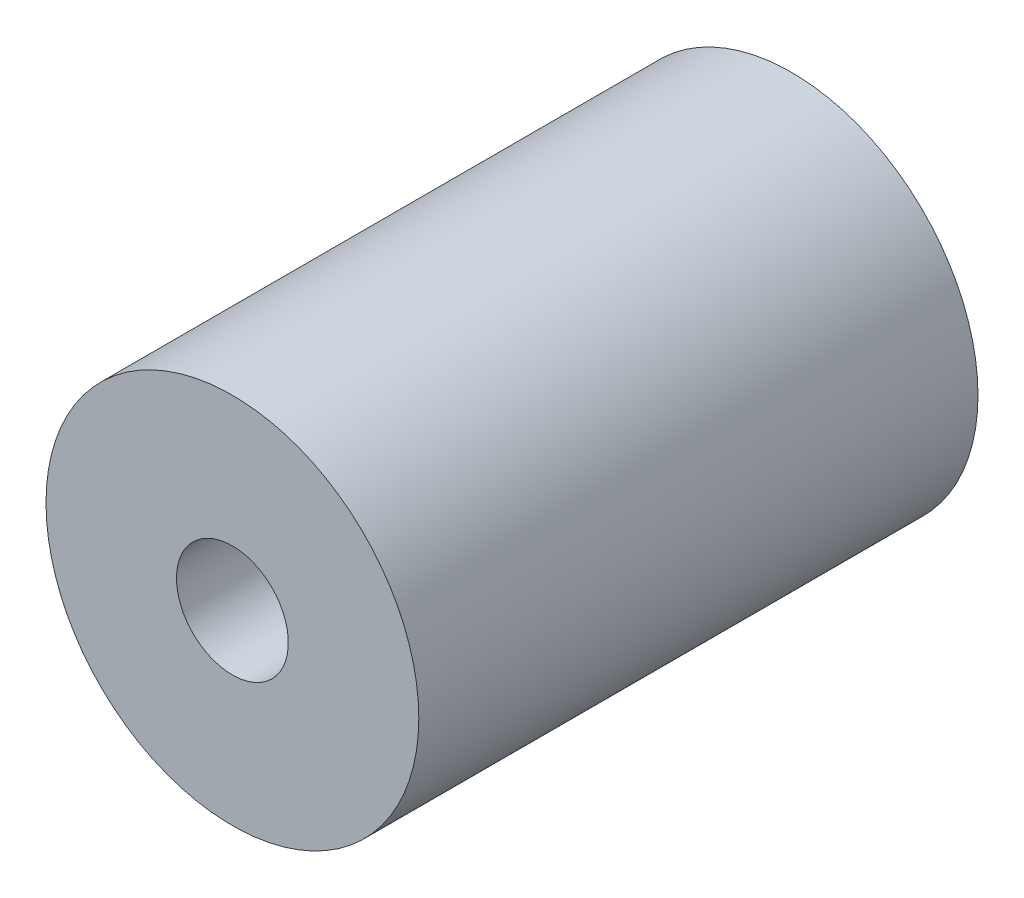
ISO-10303-21;
HEADER;
FILE_DESCRIPTION(('STEP AP214'),'2;1');
FILE_NAME('part.step','',(''),(''),'','','');
FILE_SCHEMA(('AUTOMOTIVE_DESIGN { 1 0 10303 214 1 1 1 1 }'));
ENDSEC;
DATA;
#1=APPLICATION_CONTEXT('core data for automotive mechanical design processes');
#2=APPLICATION_PROTOCOL_DEFINITION('international standard','automotive_design',2000,#1);
#3=PRODUCT_CONTEXT('',#1,'mechanical');
#4=PRODUCT('Part','Part','',(#3));
#5=PRODUCT_RELATED_PRODUCT_CATEGORY('part','',(#4));
#6=PRODUCT_DEFINITION_FORMATION('','',#4);
#7=PRODUCT_DEFINITION_CONTEXT('part definition',#1,'design');
#8=PRODUCT_DEFINITION('design','',#6,#7);
#9=PRODUCT_DEFINITION_SHAPE('','',#8);
#10=(LENGTH_UNIT() NAMED_UNIT(*) SI_UNIT(.MILLI.,.METRE.));
#11=(NAMED_UNIT(*) PLANE_ANGLE_UNIT() SI_UNIT($,.RADIAN.));
#12=(NAMED_UNIT(*) SI_UNIT($,.STERADIAN.) SOLID_ANGLE_UNIT());
#13=UNCERTAINTY_MEASURE_WITH_UNIT(LENGTH_MEASURE(1.E-05),#10,'distance_accuracy_value','');
#14=(GEOMETRIC_REPRESENTATION_CONTEXT(3) GLOBAL_UNCERTAINTY_ASSIGNED_CONTEXT((#13)) GLOBAL_UNIT_ASSIGNED_CONTEXT((#10,
#11,#12)) REPRESENTATION_CONTEXT('',''));
#15=CARTESIAN_POINT('',(0.,0.,0.));
#16=DIRECTION('',(0.,0.,1.));
#17=DIRECTION('',(1.,0.,0.));
#18=AXIS2_PLACEMENT_3D('',#15,#16,#17);
#19=CARTESIAN_POINT('',(10.9493165231331,-75.4974676378999,0.));
#20=DIRECTION('',(0.,0.,1.));
#21=DIRECTION('',(1.,0.,0.));
#22=AXIS2_PLACEMENT_3D('',#19,#20,#21);
#23=PLANE('',#22);
#24=CARTESIAN_POINT('',(10.9493165231331,-75.4974676378999,0.));
#25=DIRECTION('',(0.,0.,1.));
#26=DIRECTION('',(1.,0.,0.));
#27=AXIS2_PLACEMENT_3D('',#24,#25,#26);
#28=CIRCLE('',#27,5.);
#29=CARTESIAN_POINT('',(15.9493165231331,-75.4974676378999,0.));
#30=VERTEX_POINT('',#29);
#31=EDGE_CURVE('E36',#30,#30,#28,.T.);
#32=ORIENTED_EDGE('',*,*,#31,.F.);
#33=EDGE_LOOP('',(#32));
#34=FACE_BOUND('',#33,.T.);
#35=CARTESIAN_POINT('',(10.9493165231358,-75.4974676378883,0.));
#36=DIRECTION('',(0.,0.,-1.));
#37=DIRECTION('',(-1.,0.,0.));
#38=AXIS2_PLACEMENT_3D('',#35,#36,#37);
#39=CIRCLE('',#38,1.49999999999999);
#40=CARTESIAN_POINT('',(9.44931652313578,-75.4974676378883,0.));
#41=VERTEX_POINT('',#40);
#42=EDGE_CURVE('E47',#41,#41,#39,.T.);
#43=ORIENTED_EDGE('',*,*,#42,.F.);
#44=EDGE_LOOP('',(#43));
#45=FACE_BOUND('',#44,.T.);
#46=ADVANCED_FACE('F32',(#34,#45),#23,.F.);
#47=CARTESIAN_POINT('',(10.9493165231331,-75.4974676378999,15.));
#48=DIRECTION('',(0.,0.,-1.));
#49=DIRECTION('',(-1.,0.,0.));
#50=AXIS2_PLACEMENT_3D('',#47,#48,#49);
#51=CYLINDRICAL_SURFACE('',#50,5.);
#52=CARTESIAN_POINT('',(10.9493165231331,-75.4974676378999,15.));
#53=DIRECTION('',(0.,0.,1.));
#54=DIRECTION('',(1.,0.,0.));
#55=AXIS2_PLACEMENT_3D('',#52,#53,#54);
#56=CIRCLE('',#55,5.);
#57=CARTESIAN_POINT('',(15.9493165231331,-75.4974676378999,15.));
#58=VERTEX_POINT('',#57);
#59=EDGE_CURVE('E10',#58,#58,#56,.T.);
#60=ORIENTED_EDGE('',*,*,#59,.F.);
#61=EDGE_LOOP('',(#60));
#62=FACE_BOUND('',#61,.T.);
#63=ORIENTED_EDGE('',*,*,#31,.T.);
#64=EDGE_LOOP('',(#63));
#65=FACE_BOUND('',#64,.T.);
#66=ADVANCED_FACE('F34',(#62,#65),#51,.T.);
#67=CARTESIAN_POINT('',(10.9493165231331,-75.4974676378999,15.));
#68=DIRECTION('',(0.,0.,1.));
#69=DIRECTION('',(1.,0.,0.));
#70=AXIS2_PLACEMENT_3D('',#67,#68,#69);
#71=PLANE('',#70);
#72=CARTESIAN_POINT('',(10.9493165231358,-75.4974676378883,15.));
#73=DIRECTION('',(0.,0.,-1.));
#74=DIRECTION('',(-1.,0.,0.));
#75=AXIS2_PLACEMENT_3D('',#72,#73,#74);
#76=CIRCLE('',#75,1.5);
#77=CARTESIAN_POINT('',(9.44931652313578,-75.4974676378883,15.));
#78=VERTEX_POINT('',#77);
#79=EDGE_CURVE('E43',#78,#78,#76,.T.);
#80=ORIENTED_EDGE('',*,*,#79,.T.);
#81=EDGE_LOOP('',(#80));
#82=FACE_BOUND('',#81,.T.);
#83=ORIENTED_EDGE('',*,*,#59,.T.);
#84=EDGE_LOOP('',(#83));
#85=FACE_BOUND('',#84,.T.);
#86=ADVANCED_FACE('F58',(#82,#85),#71,.T.);
#87=CARTESIAN_POINT('',(10.9493165231358,-75.4974676378883,0.));
#88=DIRECTION('',(0.,0.,-1.));
#89=DIRECTION('',(-1.,0.,0.));
#90=AXIS2_PLACEMENT_3D('',#87,#88,#89);
#91=CYLINDRICAL_SURFACE('',#90,1.49999999999999);
#92=ORIENTED_EDGE('',*,*,#79,.F.);
#93=EDGE_LOOP('',(#92));
#94=FACE_BOUND('',#93,.T.);
#95=ORIENTED_EDGE('',*,*,#42,.T.);
#96=EDGE_LOOP('',(#95));
#97=FACE_BOUND('',#96,.T.);
#98=ADVANCED_FACE('F51',(#94,#97),#91,.F.);
#99=CLOSED_SHELL('',(#46,#66,#86,#98));
#100=MANIFOLD_SOLID_BREP('B2',#99);
#101=ADVANCED_BREP_SHAPE_REPRESENTATION('',(#18,#100),#14);
#102=SHAPE_DEFINITION_REPRESENTATION(#9,#101);
ENDSEC;
END-ISO-10303-21;
